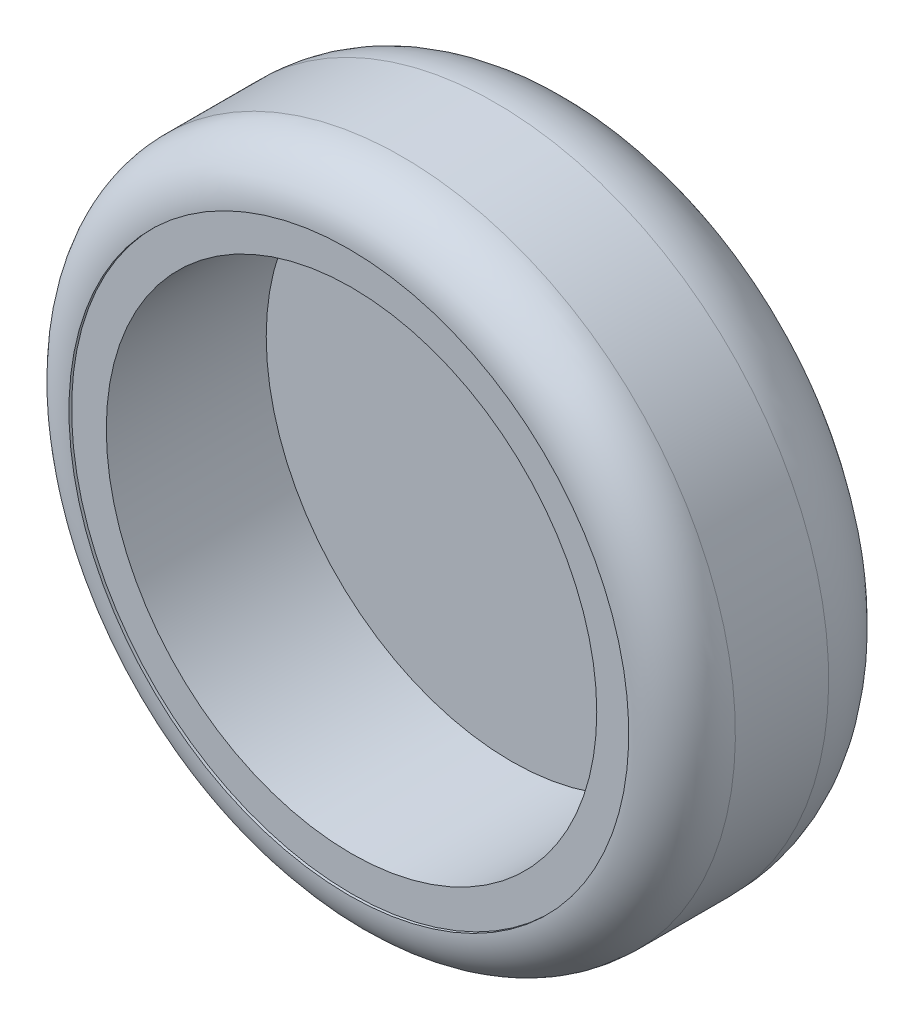
ISO-10303-21;
HEADER;
FILE_DESCRIPTION(('STEP AP214'),'2;1');
FILE_NAME('part.step','',(''),(''),'','','');
FILE_SCHEMA(('AUTOMOTIVE_DESIGN { 1 0 10303 214 1 1 1 1 }'));
ENDSEC;
DATA;
#1=APPLICATION_CONTEXT('core data for automotive mechanical design processes');
#2=APPLICATION_PROTOCOL_DEFINITION('international standard','automotive_design',2000,#1);
#3=PRODUCT_CONTEXT('',#1,'mechanical');
#4=PRODUCT('Part','Part','',(#3));
#5=PRODUCT_RELATED_PRODUCT_CATEGORY('part','',(#4));
#6=PRODUCT_DEFINITION_FORMATION('','',#4);
#7=PRODUCT_DEFINITION_CONTEXT('part definition',#1,'design');
#8=PRODUCT_DEFINITION('design','',#6,#7);
#9=PRODUCT_DEFINITION_SHAPE('','',#8);
#10=(LENGTH_UNIT() NAMED_UNIT(*) SI_UNIT(.MILLI.,.METRE.));
#11=(NAMED_UNIT(*) PLANE_ANGLE_UNIT() SI_UNIT($,.RADIAN.));
#12=(NAMED_UNIT(*) SI_UNIT($,.STERADIAN.) SOLID_ANGLE_UNIT());
#13=UNCERTAINTY_MEASURE_WITH_UNIT(LENGTH_MEASURE(1.E-05),#10,'distance_accuracy_value','');
#14=(GEOMETRIC_REPRESENTATION_CONTEXT(3) GLOBAL_UNCERTAINTY_ASSIGNED_CONTEXT((#13)) GLOBAL_UNIT_ASSIGNED_CONTEXT((#10,
#11,#12)) REPRESENTATION_CONTEXT('',''));
#15=CARTESIAN_POINT('',(0.,0.,0.));
#16=DIRECTION('',(0.,0.,1.));
#17=DIRECTION('',(1.,0.,0.));
#18=AXIS2_PLACEMENT_3D('',#15,#16,#17);
#19=CARTESIAN_POINT('',(0.,9.2,4.4));
#20=DIRECTION('',(0.,0.,-1.));
#21=DIRECTION('',(0.,1.,0.));
#22=AXIS2_PLACEMENT_3D('',#19,#20,#21);
#23=PLANE('',#22);
#24=CARTESIAN_POINT('',(0.,0.,4.4));
#25=DIRECTION('',(0.,0.,1.));
#26=DIRECTION('',(0.,-1.,0.));
#27=AXIS2_PLACEMENT_3D('',#24,#25,#26);
#28=CIRCLE('',#27,9.2);
#29=CARTESIAN_POINT('',(0.,-9.2,4.4));
#30=VERTEX_POINT('',#29);
#31=EDGE_CURVE('E10',#30,#30,#28,.T.);
#32=ORIENTED_EDGE('',*,*,#31,.F.);
#33=EDGE_LOOP('',(#32));
#34=FACE_BOUND('',#33,.T.);
#35=CARTESIAN_POINT('',(0.,0.,4.4));
#36=DIRECTION('',(0.,0.,1.));
#37=DIRECTION('',(0.,-1.,0.));
#38=AXIS2_PLACEMENT_3D('',#35,#36,#37);
#39=CIRCLE('',#38,10.5);
#40=CARTESIAN_POINT('',(0.,-10.5,4.4));
#41=VERTEX_POINT('',#40);
#42=EDGE_CURVE('E58',#41,#41,#39,.T.);
#43=ORIENTED_EDGE('',*,*,#42,.T.);
#44=EDGE_LOOP('',(#43));
#45=FACE_BOUND('',#44,.T.);
#46=ADVANCED_FACE('F33',(#34,#45),#23,.F.);
#47=CARTESIAN_POINT('',(0.,0.,-1.6));
#48=DIRECTION('',(0.,0.,1.));
#49=DIRECTION('',(0.,-1.,0.));
#50=AXIS2_PLACEMENT_3D('',#47,#48,#49);
#51=CYLINDRICAL_SURFACE('',#50,9.2);
#52=CARTESIAN_POINT('',(0.,0.,-1.6));
#53=DIRECTION('',(0.,0.,1.));
#54=DIRECTION('',(0.,-1.,0.));
#55=AXIS2_PLACEMENT_3D('',#52,#53,#54);
#56=CIRCLE('',#55,9.2);
#57=CARTESIAN_POINT('',(0.,-9.2,-1.6));
#58=VERTEX_POINT('',#57);
#59=EDGE_CURVE('E39',#58,#58,#56,.T.);
#60=ORIENTED_EDGE('',*,*,#59,.F.);
#61=EDGE_LOOP('',(#60));
#62=FACE_BOUND('',#61,.T.);
#63=ORIENTED_EDGE('',*,*,#31,.T.);
#64=EDGE_LOOP('',(#63));
#65=FACE_BOUND('',#64,.T.);
#66=ADVANCED_FACE('F94',(#62,#65),#51,.F.);
#67=CARTESIAN_POINT('',(0.,9.2,-1.6));
#68=DIRECTION('',(0.,0.,-1.));
#69=DIRECTION('',(0.,1.,0.));
#70=AXIS2_PLACEMENT_3D('',#67,#68,#69);
#71=PLANE('',#70);
#72=ORIENTED_EDGE('',*,*,#59,.T.);
#73=EDGE_LOOP('',(#72));
#74=FACE_BOUND('',#73,.T.);
#75=ADVANCED_FACE('F89',(#74),#71,.F.);
#76=CARTESIAN_POINT('',(0.,0.,-4.5));
#77=DIRECTION('',(0.,0.,1.));
#78=DIRECTION('',(0.,-1.,0.));
#79=AXIS2_PLACEMENT_3D('',#76,#77,#78);
#80=PLANE('',#79);
#81=CARTESIAN_POINT('',(0.,0.,-4.5));
#82=DIRECTION('',(0.,0.,1.));
#83=DIRECTION('',(0.,-1.,0.));
#84=AXIS2_PLACEMENT_3D('',#81,#82,#83);
#85=CIRCLE('',#84,8.99999999999998);
#86=CARTESIAN_POINT('',(0.,-8.99999999999998,-4.5));
#87=VERTEX_POINT('',#86);
#88=EDGE_CURVE('E43',#87,#87,#85,.T.);
#89=ORIENTED_EDGE('',*,*,#88,.F.);
#90=EDGE_LOOP('',(#89));
#91=FACE_BOUND('',#90,.T.);
#92=ADVANCED_FACE('F84',(#91),#80,.F.);
#93=CARTESIAN_POINT('',(0.,0.,-0.999999999999999));
#94=DIRECTION('',(0.,0.,1.));
#95=DIRECTION('',(0.,-1.,0.));
#96=AXIS2_PLACEMENT_3D('',#93,#94,#95);
#97=TOROIDAL_SURFACE('',#96,9.,3.5);
#98=CARTESIAN_POINT('',(0.,0.,-0.999999999999974));
#99=DIRECTION('',(0.,0.,1.));
#100=DIRECTION('',(0.,-1.,0.));
#101=AXIS2_PLACEMENT_3D('',#98,#99,#100);
#102=CIRCLE('',#101,12.5);
#103=CARTESIAN_POINT('',(0.,-12.5,-0.999999999999974));
#104=VERTEX_POINT('',#103);
#105=EDGE_CURVE('E47',#104,#104,#102,.T.);
#106=ORIENTED_EDGE('',*,*,#105,.F.);
#107=EDGE_LOOP('',(#106));
#108=FACE_BOUND('',#107,.T.);
#109=ORIENTED_EDGE('',*,*,#88,.T.);
#110=EDGE_LOOP('',(#109));
#111=FACE_BOUND('',#110,.T.);
#112=ADVANCED_FACE('F78',(#108,#111),#97,.T.);
#113=CARTESIAN_POINT('',(0.,0.,-1.6));
#114=DIRECTION('',(0.,0.,1.));
#115=DIRECTION('',(0.,-1.,0.));
#116=AXIS2_PLACEMENT_3D('',#113,#114,#115);
#117=CYLINDRICAL_SURFACE('',#116,12.5);
#118=CARTESIAN_POINT('',(0.,0.,2.5));
#119=DIRECTION('',(0.,0.,1.));
#120=DIRECTION('',(0.,-1.,0.));
#121=AXIS2_PLACEMENT_3D('',#118,#119,#120);
#122=CIRCLE('',#121,12.5);
#123=CARTESIAN_POINT('',(0.,-12.5,2.5));
#124=VERTEX_POINT('',#123);
#125=EDGE_CURVE('E52',#124,#124,#122,.T.);
#126=ORIENTED_EDGE('',*,*,#125,.F.);
#127=EDGE_LOOP('',(#126));
#128=FACE_BOUND('',#127,.T.);
#129=ORIENTED_EDGE('',*,*,#105,.T.);
#130=EDGE_LOOP('',(#129));
#131=FACE_BOUND('',#130,.T.);
#132=ADVANCED_FACE('F72',(#128,#131),#117,.T.);
#133=CARTESIAN_POINT('',(0.,0.,2.5));
#134=DIRECTION('',(0.,0.,1.));
#135=DIRECTION('',(0.,-1.,0.));
#136=AXIS2_PLACEMENT_3D('',#133,#134,#135);
#137=TOROIDAL_SURFACE('',#136,10.5,2.);
#138=CARTESIAN_POINT('',(0.,0.,4.5));
#139=DIRECTION('',(0.,0.,1.));
#140=DIRECTION('',(0.,-1.,0.));
#141=AXIS2_PLACEMENT_3D('',#138,#139,#140);
#142=CIRCLE('',#141,10.5);
#143=CARTESIAN_POINT('',(0.,-10.5,4.5));
#144=VERTEX_POINT('',#143);
#145=EDGE_CURVE('E55',#144,#144,#142,.T.);
#146=ORIENTED_EDGE('',*,*,#145,.F.);
#147=EDGE_LOOP('',(#146));
#148=FACE_BOUND('',#147,.T.);
#149=ORIENTED_EDGE('',*,*,#125,.T.);
#150=EDGE_LOOP('',(#149));
#151=FACE_BOUND('',#150,.T.);
#152=ADVANCED_FACE('F66',(#148,#151),#137,.T.);
#153=CARTESIAN_POINT('',(0.,0.,-1.6));
#154=DIRECTION('',(0.,0.,1.));
#155=DIRECTION('',(0.,-1.,0.));
#156=AXIS2_PLACEMENT_3D('',#153,#154,#155);
#157=CYLINDRICAL_SURFACE('',#156,10.5);
#158=ORIENTED_EDGE('',*,*,#42,.F.);
#159=EDGE_LOOP('',(#158));
#160=FACE_BOUND('',#159,.T.);
#161=ORIENTED_EDGE('',*,*,#145,.T.);
#162=EDGE_LOOP('',(#161));
#163=FACE_BOUND('',#162,.T.);
#164=ADVANCED_FACE('F63',(#160,#163),#157,.F.);
#165=CLOSED_SHELL('',(#46,#66,#75,#92,#112,#132,#152,#164));
#166=MANIFOLD_SOLID_BREP('B2',#165);
#167=ADVANCED_BREP_SHAPE_REPRESENTATION('',(#18,#166),#14);
#168=SHAPE_DEFINITION_REPRESENTATION(#9,#167);
ENDSEC;
END-ISO-10303-21;
